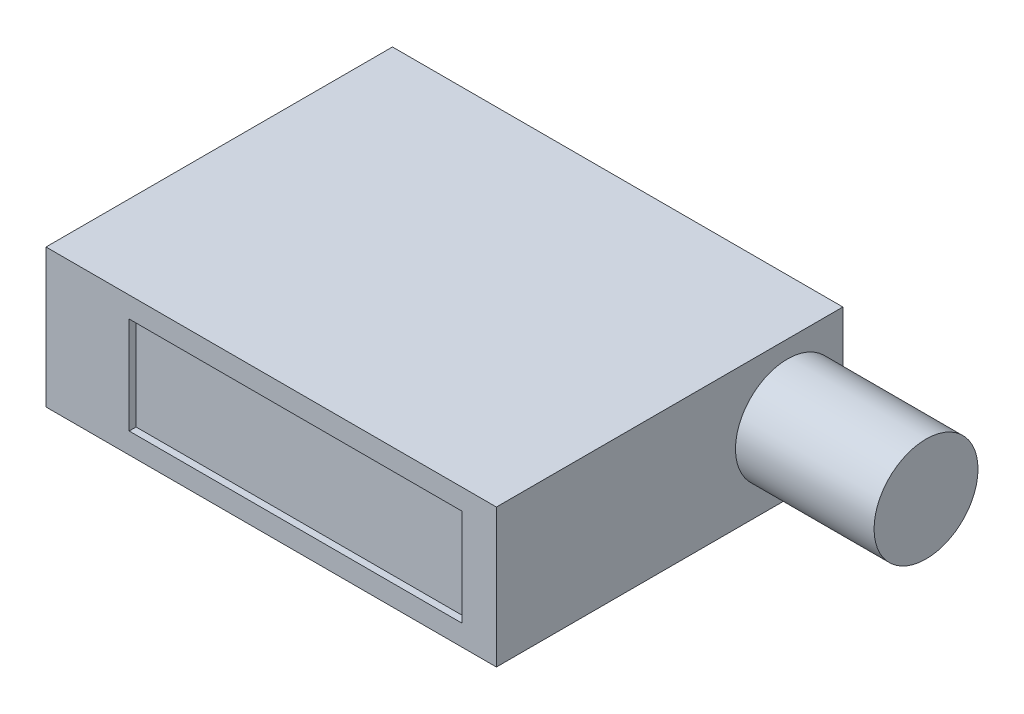
ISO-10303-21;
HEADER;
FILE_DESCRIPTION(('STEP AP214'),'2;1');
FILE_NAME('part.step','',(''),(''),'','','');
FILE_SCHEMA(('AUTOMOTIVE_DESIGN { 1 0 10303 214 1 1 1 1 }'));
ENDSEC;
DATA;
#1=APPLICATION_CONTEXT('core data for automotive mechanical design processes');
#2=APPLICATION_PROTOCOL_DEFINITION('international standard','automotive_design',2000,#1);
#3=PRODUCT_CONTEXT('',#1,'mechanical');
#4=PRODUCT('Part','Part','',(#3));
#5=PRODUCT_RELATED_PRODUCT_CATEGORY('part','',(#4));
#6=PRODUCT_DEFINITION_FORMATION('','',#4);
#7=PRODUCT_DEFINITION_CONTEXT('part definition',#1,'design');
#8=PRODUCT_DEFINITION('design','',#6,#7);
#9=PRODUCT_DEFINITION_SHAPE('','',#8);
#10=(LENGTH_UNIT() NAMED_UNIT(*) SI_UNIT(.MILLI.,.METRE.));
#11=(NAMED_UNIT(*) PLANE_ANGLE_UNIT() SI_UNIT($,.RADIAN.));
#12=(NAMED_UNIT(*) SI_UNIT($,.STERADIAN.) SOLID_ANGLE_UNIT());
#13=UNCERTAINTY_MEASURE_WITH_UNIT(LENGTH_MEASURE(1.E-05),#10,'distance_accuracy_value','');
#14=(GEOMETRIC_REPRESENTATION_CONTEXT(3) GLOBAL_UNCERTAINTY_ASSIGNED_CONTEXT((#13)) GLOBAL_UNIT_ASSIGNED_CONTEXT((#10,
#11,#12)) REPRESENTATION_CONTEXT('',''));
#15=CARTESIAN_POINT('',(0.,0.,0.));
#16=DIRECTION('',(0.,0.,1.));
#17=DIRECTION('',(1.,0.,0.));
#18=AXIS2_PLACEMENT_3D('',#15,#16,#17);
#19=CARTESIAN_POINT('',(32.5,20.,-25.));
#20=DIRECTION('',(-1.,0.,0.));
#21=DIRECTION('',(0.,0.,1.));
#22=AXIS2_PLACEMENT_3D('',#19,#20,#21);
#23=PLANE('',#22);
#24=CARTESIAN_POINT('',(32.5,10.,-17.));
#25=DIRECTION('',(-1.,0.,0.));
#26=DIRECTION('',(0.,0.,1.));
#27=AXIS2_PLACEMENT_3D('',#24,#25,#26);
#28=CIRCLE('',#27,7.5);
#29=CARTESIAN_POINT('',(32.5,10.,-9.50000000000002));
#30=VERTEX_POINT('',#29);
#31=EDGE_CURVE('E11',#30,#30,#28,.F.);
#32=ORIENTED_EDGE('',*,*,#31,.F.);
#33=EDGE_LOOP('',(#32));
#34=FACE_BOUND('',#33,.T.);
#35=DIRECTION('',(0.,0.,-1.));
#36=VECTOR('',#35,1.);
#37=CARTESIAN_POINT('',(32.5,0.,-25.));
#38=LINE('',#37,#36);
#39=CARTESIAN_POINT('',(32.5,0.,25.));
#40=VERTEX_POINT('',#39);
#41=CARTESIAN_POINT('',(32.5,0.,-25.));
#42=VERTEX_POINT('',#41);
#43=EDGE_CURVE('E146',#40,#42,#38,.T.);
#44=ORIENTED_EDGE('',*,*,#43,.T.);
#45=DIRECTION('',(0.,-1.,0.));
#46=VECTOR('',#45,1.);
#47=CARTESIAN_POINT('',(32.5,20.,-25.));
#48=LINE('',#47,#46);
#49=CARTESIAN_POINT('',(32.5,20.,-25.));
#50=VERTEX_POINT('',#49);
#51=EDGE_CURVE('E42',#50,#42,#48,.T.);
#52=ORIENTED_EDGE('',*,*,#51,.F.);
#53=DIRECTION('',(0.,0.,-1.));
#54=VECTOR('',#53,1.);
#55=CARTESIAN_POINT('',(32.5,20.,-25.));
#56=LINE('',#55,#54);
#57=CARTESIAN_POINT('',(32.5,20.,25.));
#58=VERTEX_POINT('',#57);
#59=EDGE_CURVE('E150',#58,#50,#56,.T.);
#60=ORIENTED_EDGE('',*,*,#59,.F.);
#61=DIRECTION('',(0.,-1.,0.));
#62=VECTOR('',#61,1.);
#63=CARTESIAN_POINT('',(32.5,20.,25.));
#64=LINE('',#63,#62);
#65=EDGE_CURVE('E156',#58,#40,#64,.T.);
#66=ORIENTED_EDGE('',*,*,#65,.T.);
#67=EDGE_LOOP('',(#44,#52,#60,#66));
#68=FACE_BOUND('',#67,.T.);
#69=ADVANCED_FACE('F35',(#34,#68),#23,.F.);
#70=CARTESIAN_POINT('',(-32.5,20.,-25.));
#71=DIRECTION('',(0.,0.,1.));
#72=DIRECTION('',(1.,0.,0.));
#73=AXIS2_PLACEMENT_3D('',#70,#71,#72);
#74=PLANE('',#73);
#75=DIRECTION('',(-1.,0.,0.));
#76=VECTOR('',#75,1.);
#77=CARTESIAN_POINT('',(-32.5,0.,-25.));
#78=LINE('',#77,#76);
#79=CARTESIAN_POINT('',(-32.5,0.,-25.));
#80=VERTEX_POINT('',#79);
#81=EDGE_CURVE('E159',#42,#80,#78,.T.);
#82=ORIENTED_EDGE('',*,*,#81,.T.);
#83=DIRECTION('',(0.,-1.,0.));
#84=VECTOR('',#83,1.);
#85=CARTESIAN_POINT('',(-32.5,20.,-25.));
#86=LINE('',#85,#84);
#87=CARTESIAN_POINT('',(-32.5,20.,-25.));
#88=VERTEX_POINT('',#87);
#89=EDGE_CURVE('E167',#88,#80,#86,.T.);
#90=ORIENTED_EDGE('',*,*,#89,.F.);
#91=DIRECTION('',(-1.,0.,0.));
#92=VECTOR('',#91,1.);
#93=CARTESIAN_POINT('',(-32.5,20.,-25.));
#94=LINE('',#93,#92);
#95=EDGE_CURVE('E87',#50,#88,#94,.T.);
#96=ORIENTED_EDGE('',*,*,#95,.F.);
#97=ORIENTED_EDGE('',*,*,#51,.T.);
#98=EDGE_LOOP('',(#82,#90,#96,#97));
#99=FACE_BOUND('',#98,.T.);
#100=ADVANCED_FACE('F170',(#99),#74,.F.);
#101=CARTESIAN_POINT('',(-32.5,20.,-25.));
#102=DIRECTION('',(1.,0.,0.));
#103=DIRECTION('',(0.,0.,-1.));
#104=AXIS2_PLACEMENT_3D('',#101,#102,#103);
#105=PLANE('',#104);
#106=DIRECTION('',(0.,0.,1.));
#107=VECTOR('',#106,1.);
#108=CARTESIAN_POINT('',(-32.5,0.,-25.));
#109=LINE('',#108,#107);
#110=CARTESIAN_POINT('',(-32.5,0.,25.));
#111=VERTEX_POINT('',#110);
#112=EDGE_CURVE('E161',#80,#111,#109,.T.);
#113=ORIENTED_EDGE('',*,*,#112,.T.);
#114=DIRECTION('',(0.,-1.,0.));
#115=VECTOR('',#114,1.);
#116=CARTESIAN_POINT('',(-32.5,20.,25.));
#117=LINE('',#116,#115);
#118=CARTESIAN_POINT('',(-32.5,20.,25.));
#119=VERTEX_POINT('',#118);
#120=EDGE_CURVE('E165',#119,#111,#117,.T.);
#121=ORIENTED_EDGE('',*,*,#120,.F.);
#122=DIRECTION('',(0.,0.,1.));
#123=VECTOR('',#122,1.);
#124=CARTESIAN_POINT('',(-32.5,20.,-25.));
#125=LINE('',#124,#123);
#126=EDGE_CURVE('E153',#88,#119,#125,.T.);
#127=ORIENTED_EDGE('',*,*,#126,.F.);
#128=ORIENTED_EDGE('',*,*,#89,.T.);
#129=EDGE_LOOP('',(#113,#121,#127,#128));
#130=FACE_BOUND('',#129,.T.);
#131=ADVANCED_FACE('F179',(#130),#105,.F.);
#132=CARTESIAN_POINT('',(-32.5,20.,25.));
#133=DIRECTION('',(0.,0.,-1.));
#134=DIRECTION('',(-1.,0.,0.));
#135=AXIS2_PLACEMENT_3D('',#132,#133,#134);
#136=PLANE('',#135);
#137=DIRECTION('',(-1.,0.,0.));
#138=VECTOR('',#137,1.);
#139=CARTESIAN_POINT('',(-20.5,17.,25.));
#140=LINE('',#139,#138);
#141=CARTESIAN_POINT('',(27.5,17.,25.));
#142=VERTEX_POINT('',#141);
#143=CARTESIAN_POINT('',(-20.5,17.,25.));
#144=VERTEX_POINT('',#143);
#145=EDGE_CURVE('E140',#142,#144,#140,.T.);
#146=ORIENTED_EDGE('',*,*,#145,.F.);
#147=DIRECTION('',(0.,1.,0.));
#148=VECTOR('',#147,1.);
#149=CARTESIAN_POINT('',(27.5,17.,25.));
#150=LINE('',#149,#148);
#151=CARTESIAN_POINT('',(27.5,3.,25.));
#152=VERTEX_POINT('',#151);
#153=EDGE_CURVE('E49',#152,#142,#150,.T.);
#154=ORIENTED_EDGE('',*,*,#153,.F.);
#155=DIRECTION('',(1.,0.,0.));
#156=VECTOR('',#155,1.);
#157=CARTESIAN_POINT('',(-20.5,3.,25.));
#158=LINE('',#157,#156);
#159=CARTESIAN_POINT('',(-20.5,3.,25.));
#160=VERTEX_POINT('',#159);
#161=EDGE_CURVE('E129',#160,#152,#158,.T.);
#162=ORIENTED_EDGE('',*,*,#161,.F.);
#163=DIRECTION('',(0.,-1.,0.));
#164=VECTOR('',#163,1.);
#165=CARTESIAN_POINT('',(-20.5,17.,25.));
#166=LINE('',#165,#164);
#167=EDGE_CURVE('E132',#144,#160,#166,.T.);
#168=ORIENTED_EDGE('',*,*,#167,.F.);
#169=EDGE_LOOP('',(#146,#154,#162,#168));
#170=FACE_BOUND('',#169,.T.);
#171=DIRECTION('',(1.,0.,0.));
#172=VECTOR('',#171,1.);
#173=CARTESIAN_POINT('',(-32.5,0.,25.));
#174=LINE('',#173,#172);
#175=EDGE_CURVE('E79',#111,#40,#174,.T.);
#176=ORIENTED_EDGE('',*,*,#175,.T.);
#177=ORIENTED_EDGE('',*,*,#65,.F.);
#178=DIRECTION('',(1.,0.,0.));
#179=VECTOR('',#178,1.);
#180=CARTESIAN_POINT('',(-32.5,20.,25.));
#181=LINE('',#180,#179);
#182=EDGE_CURVE('E58',#119,#58,#181,.T.);
#183=ORIENTED_EDGE('',*,*,#182,.F.);
#184=ORIENTED_EDGE('',*,*,#120,.T.);
#185=EDGE_LOOP('',(#176,#177,#183,#184));
#186=FACE_BOUND('',#185,.T.);
#187=ADVANCED_FACE('F181',(#170,#186),#136,.F.);
#188=CARTESIAN_POINT('',(0.,20.,0.));
#189=DIRECTION('',(0.,1.,0.));
#190=DIRECTION('',(0.,0.,1.));
#191=AXIS2_PLACEMENT_3D('',#188,#189,#190);
#192=PLANE('',#191);
#193=ORIENTED_EDGE('',*,*,#59,.T.);
#194=ORIENTED_EDGE('',*,*,#95,.T.);
#195=ORIENTED_EDGE('',*,*,#126,.T.);
#196=ORIENTED_EDGE('',*,*,#182,.T.);
#197=EDGE_LOOP('',(#193,#194,#195,#196));
#198=FACE_BOUND('',#197,.T.);
#199=ADVANCED_FACE('F182',(#198),#192,.T.);
#200=CARTESIAN_POINT('',(0.,0.,0.));
#201=DIRECTION('',(0.,1.,0.));
#202=DIRECTION('',(0.,0.,1.));
#203=AXIS2_PLACEMENT_3D('',#200,#201,#202);
#204=PLANE('',#203);
#205=ORIENTED_EDGE('',*,*,#43,.F.);
#206=ORIENTED_EDGE('',*,*,#175,.F.);
#207=ORIENTED_EDGE('',*,*,#112,.F.);
#208=ORIENTED_EDGE('',*,*,#81,.F.);
#209=EDGE_LOOP('',(#205,#206,#207,#208));
#210=FACE_BOUND('',#209,.T.);
#211=ADVANCED_FACE('F175',(#210),#204,.F.);
#212=CARTESIAN_POINT('',(27.5,17.,24.));
#213=DIRECTION('',(1.,0.,0.));
#214=DIRECTION('',(0.,0.,-1.));
#215=AXIS2_PLACEMENT_3D('',#212,#213,#214);
#216=PLANE('',#215);
#217=ORIENTED_EDGE('',*,*,#153,.T.);
#218=DIRECTION('',(0.,0.,1.));
#219=VECTOR('',#218,1.);
#220=CARTESIAN_POINT('',(27.5,17.,24.));
#221=LINE('',#220,#219);
#222=CARTESIAN_POINT('',(27.5,17.,24.));
#223=VERTEX_POINT('',#222);
#224=EDGE_CURVE('E107',#223,#142,#221,.T.);
#225=ORIENTED_EDGE('',*,*,#224,.F.);
#226=DIRECTION('',(0.,1.,0.));
#227=VECTOR('',#226,1.);
#228=CARTESIAN_POINT('',(27.5,17.,24.));
#229=LINE('',#228,#227);
#230=CARTESIAN_POINT('',(27.5,3.,24.));
#231=VERTEX_POINT('',#230);
#232=EDGE_CURVE('E111',#231,#223,#229,.T.);
#233=ORIENTED_EDGE('',*,*,#232,.F.);
#234=DIRECTION('',(0.,0.,1.));
#235=VECTOR('',#234,1.);
#236=CARTESIAN_POINT('',(27.5,3.,24.));
#237=LINE('',#236,#235);
#238=EDGE_CURVE('E144',#231,#152,#237,.T.);
#239=ORIENTED_EDGE('',*,*,#238,.T.);
#240=EDGE_LOOP('',(#217,#225,#233,#239));
#241=FACE_BOUND('',#240,.T.);
#242=ADVANCED_FACE('F109',(#241),#216,.F.);
#243=CARTESIAN_POINT('',(-20.5,3.,24.));
#244=DIRECTION('',(0.,-1.,0.));
#245=DIRECTION('',(0.,0.,-1.));
#246=AXIS2_PLACEMENT_3D('',#243,#244,#245);
#247=PLANE('',#246);
#248=ORIENTED_EDGE('',*,*,#161,.T.);
#249=ORIENTED_EDGE('',*,*,#238,.F.);
#250=DIRECTION('',(1.,0.,0.));
#251=VECTOR('',#250,1.);
#252=CARTESIAN_POINT('',(-20.5,3.,24.));
#253=LINE('',#252,#251);
#254=CARTESIAN_POINT('',(-20.5,3.,24.));
#255=VERTEX_POINT('',#254);
#256=EDGE_CURVE('E117',#255,#231,#253,.T.);
#257=ORIENTED_EDGE('',*,*,#256,.F.);
#258=DIRECTION('',(0.,0.,1.));
#259=VECTOR('',#258,1.);
#260=CARTESIAN_POINT('',(-20.5,3.,24.));
#261=LINE('',#260,#259);
#262=EDGE_CURVE('E147',#255,#160,#261,.T.);
#263=ORIENTED_EDGE('',*,*,#262,.T.);
#264=EDGE_LOOP('',(#248,#249,#257,#263));
#265=FACE_BOUND('',#264,.T.);
#266=ADVANCED_FACE('F214',(#265),#247,.F.);
#267=CARTESIAN_POINT('',(-20.5,17.,24.));
#268=DIRECTION('',(-1.,0.,0.));
#269=DIRECTION('',(0.,-1.,0.));
#270=AXIS2_PLACEMENT_3D('',#267,#268,#269);
#271=PLANE('',#270);
#272=ORIENTED_EDGE('',*,*,#167,.T.);
#273=ORIENTED_EDGE('',*,*,#262,.F.);
#274=DIRECTION('',(0.,-1.,0.));
#275=VECTOR('',#274,1.);
#276=CARTESIAN_POINT('',(-20.5,17.,24.));
#277=LINE('',#276,#275);
#278=CARTESIAN_POINT('',(-20.5,17.,24.));
#279=VERTEX_POINT('',#278);
#280=EDGE_CURVE('E125',#279,#255,#277,.T.);
#281=ORIENTED_EDGE('',*,*,#280,.F.);
#282=DIRECTION('',(0.,0.,1.));
#283=VECTOR('',#282,1.);
#284=CARTESIAN_POINT('',(-20.5,17.,24.));
#285=LINE('',#284,#283);
#286=EDGE_CURVE('E116',#279,#144,#285,.T.);
#287=ORIENTED_EDGE('',*,*,#286,.T.);
#288=EDGE_LOOP('',(#272,#273,#281,#287));
#289=FACE_BOUND('',#288,.T.);
#290=ADVANCED_FACE('F217',(#289),#271,.F.);
#291=CARTESIAN_POINT('',(-20.5,17.,24.));
#292=DIRECTION('',(0.,1.,0.));
#293=DIRECTION('',(0.,0.,1.));
#294=AXIS2_PLACEMENT_3D('',#291,#292,#293);
#295=PLANE('',#294);
#296=ORIENTED_EDGE('',*,*,#145,.T.);
#297=ORIENTED_EDGE('',*,*,#286,.F.);
#298=DIRECTION('',(-1.,0.,0.));
#299=VECTOR('',#298,1.);
#300=CARTESIAN_POINT('',(-20.5,17.,24.));
#301=LINE('',#300,#299);
#302=EDGE_CURVE('E120',#223,#279,#301,.T.);
#303=ORIENTED_EDGE('',*,*,#302,.F.);
#304=ORIENTED_EDGE('',*,*,#224,.T.);
#305=EDGE_LOOP('',(#296,#297,#303,#304));
#306=FACE_BOUND('',#305,.T.);
#307=ADVANCED_FACE('F121',(#306),#295,.F.);
#308=CARTESIAN_POINT('',(0.,0.,24.));
#309=DIRECTION('',(0.,0.,1.));
#310=DIRECTION('',(1.,0.,0.));
#311=AXIS2_PLACEMENT_3D('',#308,#309,#310);
#312=PLANE('',#311);
#313=ORIENTED_EDGE('',*,*,#232,.T.);
#314=ORIENTED_EDGE('',*,*,#302,.T.);
#315=ORIENTED_EDGE('',*,*,#280,.T.);
#316=ORIENTED_EDGE('',*,*,#256,.T.);
#317=EDGE_LOOP('',(#313,#314,#315,#316));
#318=FACE_BOUND('',#317,.T.);
#319=ADVANCED_FACE('F127',(#318),#312,.T.);
#320=CARTESIAN_POINT('',(52.5,10.,-17.));
#321=DIRECTION('',(-1.,0.,0.));
#322=DIRECTION('',(0.,0.,1.));
#323=AXIS2_PLACEMENT_3D('',#320,#321,#322);
#324=CYLINDRICAL_SURFACE('',#323,7.5);
#325=CARTESIAN_POINT('',(52.5,10.,-17.));
#326=DIRECTION('',(1.,0.,0.));
#327=DIRECTION('',(0.,0.,-1.));
#328=AXIS2_PLACEMENT_3D('',#325,#326,#327);
#329=CIRCLE('',#328,7.5);
#330=CARTESIAN_POINT('',(52.5,10.,-24.5));
#331=VERTEX_POINT('',#330);
#332=EDGE_CURVE('E135',#331,#331,#329,.T.);
#333=ORIENTED_EDGE('',*,*,#332,.F.);
#334=EDGE_LOOP('',(#333));
#335=FACE_BOUND('',#334,.T.);
#336=ORIENTED_EDGE('',*,*,#31,.T.);
#337=EDGE_LOOP('',(#336));
#338=FACE_BOUND('',#337,.T.);
#339=ADVANCED_FACE('F200',(#335,#338),#324,.T.);
#340=CARTESIAN_POINT('',(52.5,10.,-17.));
#341=DIRECTION('',(1.,0.,0.));
#342=DIRECTION('',(0.,0.,-1.));
#343=AXIS2_PLACEMENT_3D('',#340,#341,#342);
#344=PLANE('',#343);
#345=ORIENTED_EDGE('',*,*,#332,.T.);
#346=EDGE_LOOP('',(#345));
#347=FACE_BOUND('',#346,.T.);
#348=ADVANCED_FACE('F202',(#347),#344,.T.);
#349=CLOSED_SHELL('',(#69,#100,#131,#187,#199,#211,#242,#266,#290,#307,#319,#339,#348));
#350=MANIFOLD_SOLID_BREP('B2',#349);
#351=ADVANCED_BREP_SHAPE_REPRESENTATION('',(#18,#350),#14);
#352=SHAPE_DEFINITION_REPRESENTATION(#9,#351);
ENDSEC;
END-ISO-10303-21;
